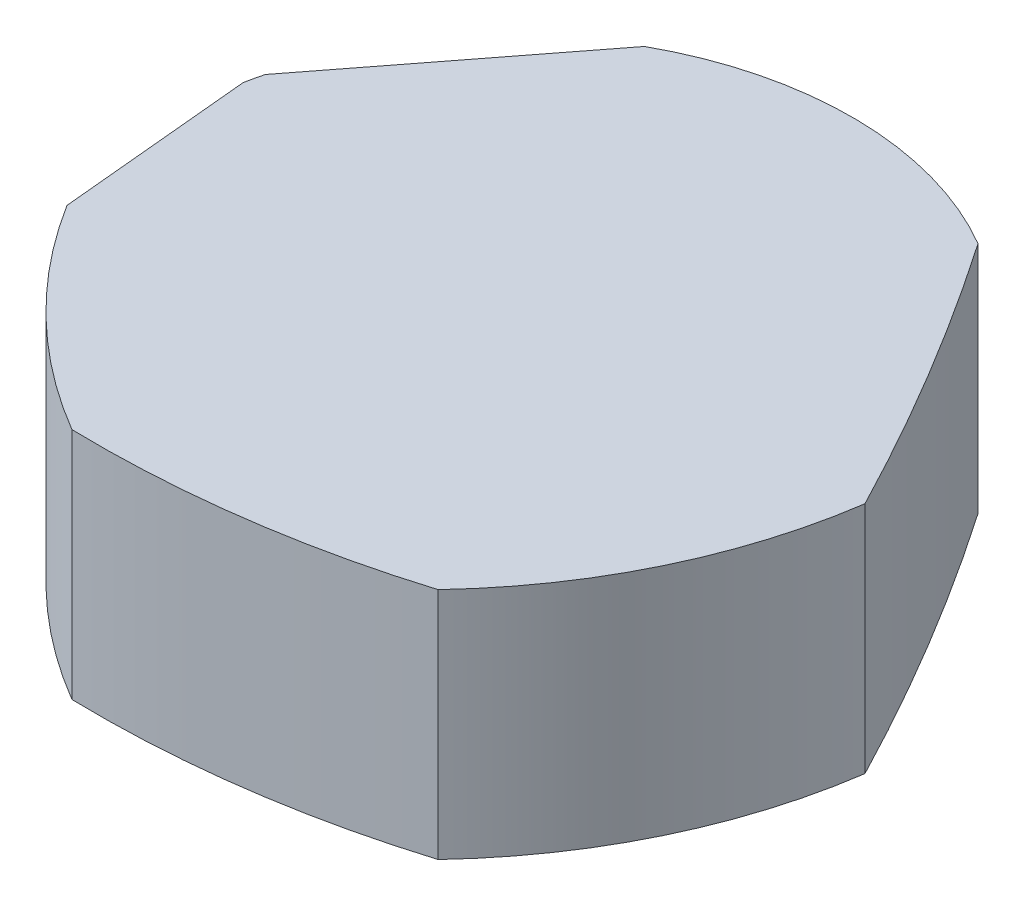
ISO-10303-21;
HEADER;
FILE_DESCRIPTION(('STEP AP214'),'2;1');
FILE_NAME('part.step','',(''),(''),'','','');
FILE_SCHEMA(('AUTOMOTIVE_DESIGN { 1 0 10303 214 1 1 1 1 }'));
ENDSEC;
DATA;
#1=APPLICATION_CONTEXT('core data for automotive mechanical design processes');
#2=APPLICATION_PROTOCOL_DEFINITION('international standard','automotive_design',2000,#1);
#3=PRODUCT_CONTEXT('',#1,'mechanical');
#4=PRODUCT('Part','Part','',(#3));
#5=PRODUCT_RELATED_PRODUCT_CATEGORY('part','',(#4));
#6=PRODUCT_DEFINITION_FORMATION('','',#4);
#7=PRODUCT_DEFINITION_CONTEXT('part definition',#1,'design');
#8=PRODUCT_DEFINITION('design','',#6,#7);
#9=PRODUCT_DEFINITION_SHAPE('','',#8);
#10=(LENGTH_UNIT() NAMED_UNIT(*) SI_UNIT(.MILLI.,.METRE.));
#11=(NAMED_UNIT(*) PLANE_ANGLE_UNIT() SI_UNIT($,.RADIAN.));
#12=(NAMED_UNIT(*) SI_UNIT($,.STERADIAN.) SOLID_ANGLE_UNIT());
#13=UNCERTAINTY_MEASURE_WITH_UNIT(LENGTH_MEASURE(1.E-05),#10,'distance_accuracy_value','');
#14=(GEOMETRIC_REPRESENTATION_CONTEXT(3) GLOBAL_UNCERTAINTY_ASSIGNED_CONTEXT((#13)) GLOBAL_UNIT_ASSIGNED_CONTEXT((#10,
#11,#12)) REPRESENTATION_CONTEXT('',''));
#15=CARTESIAN_POINT('',(0.,0.,0.));
#16=DIRECTION('',(0.,0.,1.));
#17=DIRECTION('',(1.,0.,0.));
#18=AXIS2_PLACEMENT_3D('',#15,#16,#17);
#19=CARTESIAN_POINT('',(73.6872230639614,100.,-75.5879370558731));
#20=DIRECTION('',(0.,-1.,0.));
#21=DIRECTION('',(0.,0.,-1.));
#22=AXIS2_PLACEMENT_3D('',#19,#20,#21);
#23=CYLINDRICAL_SURFACE('',#22,246.295937741167);
#24=CARTESIAN_POINT('',(73.6872230639614,0.,-75.5879370558731));
#25=DIRECTION('',(0.,1.,0.));
#26=DIRECTION('',(0.,0.,1.));
#27=AXIS2_PLACEMENT_3D('',#24,#25,#26);
#28=CIRCLE('',#27,246.295937741167);
#29=CARTESIAN_POINT('',(-135.351509673323,0.,54.659892727932));
#30=VERTEX_POINT('',#29);
#31=CARTESIAN_POINT('',(-51.195880989318,0.,136.699366544268));
#32=VERTEX_POINT('',#31);
#33=EDGE_CURVE('E140',#30,#32,#28,.T.);
#34=ORIENTED_EDGE('',*,*,#33,.T.);
#35=DIRECTION('',(0.,-1.,0.));
#36=VECTOR('',#35,1.);
#37=CARTESIAN_POINT('',(-51.195880989318,100.,136.699366544268));
#38=LINE('',#37,#36);
#39=CARTESIAN_POINT('',(-51.195880989318,100.,136.699366544268));
#40=VERTEX_POINT('',#39);
#41=EDGE_CURVE('E11',#40,#32,#38,.T.);
#42=ORIENTED_EDGE('',*,*,#41,.F.);
#43=CARTESIAN_POINT('',(73.6872230639614,100.,-75.5879370558731));
#44=DIRECTION('',(0.,1.,0.));
#45=DIRECTION('',(0.,0.,1.));
#46=AXIS2_PLACEMENT_3D('',#43,#44,#45);
#47=CIRCLE('',#46,246.295937741167);
#48=CARTESIAN_POINT('',(-135.351509673323,100.,54.659892727932));
#49=VERTEX_POINT('',#48);
#50=EDGE_CURVE('E162',#49,#40,#47,.T.);
#51=ORIENTED_EDGE('',*,*,#50,.F.);
#52=DIRECTION('',(0.,-1.,0.));
#53=VECTOR('',#52,1.);
#54=CARTESIAN_POINT('',(-135.351509673323,100.,54.659892727932));
#55=LINE('',#54,#53);
#56=EDGE_CURVE('E136',#49,#30,#55,.T.);
#57=ORIENTED_EDGE('',*,*,#56,.T.);
#58=EDGE_LOOP('',(#34,#42,#51,#57));
#59=FACE_BOUND('',#58,.T.);
#60=ADVANCED_FACE('F39',(#59),#23,.T.);
#61=CARTESIAN_POINT('',(-41.1861018587533,100.,-297.581542449005));
#62=DIRECTION('',(0.,-1.,0.));
#63=DIRECTION('',(0.,0.,-1.));
#64=AXIS2_PLACEMENT_3D('',#61,#62,#63);
#65=CYLINDRICAL_SURFACE('',#64,434.396251818851);
#66=CARTESIAN_POINT('',(-41.1861018587533,0.,-297.581542449005));
#67=DIRECTION('',(0.,1.,0.));
#68=DIRECTION('',(0.,0.,1.));
#69=AXIS2_PLACEMENT_3D('',#66,#67,#68);
#70=CIRCLE('',#69,434.396251818851);
#71=CARTESIAN_POINT('',(86.3993353750459,0.,117.655811121368));
#72=VERTEX_POINT('',#71);
#73=EDGE_CURVE('E144',#32,#72,#70,.T.);
#74=ORIENTED_EDGE('',*,*,#73,.T.);
#75=DIRECTION('',(0.,-1.,0.));
#76=VECTOR('',#75,1.);
#77=CARTESIAN_POINT('',(86.3993353750459,100.,117.655811121368));
#78=LINE('',#77,#76);
#79=CARTESIAN_POINT('',(86.3993353750459,100.,117.655811121368));
#80=VERTEX_POINT('',#79);
#81=EDGE_CURVE('E48',#80,#72,#78,.T.);
#82=ORIENTED_EDGE('',*,*,#81,.F.);
#83=CARTESIAN_POINT('',(-41.1861018587533,100.,-297.581542449005));
#84=DIRECTION('',(0.,1.,0.));
#85=DIRECTION('',(0.,0.,1.));
#86=AXIS2_PLACEMENT_3D('',#83,#84,#85);
#87=CIRCLE('',#86,434.396251818851);
#88=EDGE_CURVE('E99',#40,#80,#87,.T.);
#89=ORIENTED_EDGE('',*,*,#88,.F.);
#90=ORIENTED_EDGE('',*,*,#41,.T.);
#91=EDGE_LOOP('',(#74,#82,#89,#90));
#92=FACE_BOUND('',#91,.T.);
#93=ADVANCED_FACE('F208',(#92),#65,.T.);
#94=CARTESIAN_POINT('',(-78.5306853637809,100.,-37.9310166919516));
#95=DIRECTION('',(0.,-1.,0.));
#96=DIRECTION('',(0.,0.,-1.));
#97=AXIS2_PLACEMENT_3D('',#94,#95,#96);
#98=CYLINDRICAL_SURFACE('',#97,226.735909661265);
#99=CARTESIAN_POINT('',(-78.5306853637809,0.,-37.9310166919516));
#100=DIRECTION('',(0.,1.,0.));
#101=DIRECTION('',(0.,0.,1.));
#102=AXIS2_PLACEMENT_3D('',#99,#100,#101);
#103=CIRCLE('',#102,226.735909661265);
#104=CARTESIAN_POINT('',(145.869241729159,0.,-5.46803083721936));
#105=VERTEX_POINT('',#104);
#106=EDGE_CURVE('E147',#72,#105,#103,.T.);
#107=ORIENTED_EDGE('',*,*,#106,.T.);
#108=DIRECTION('',(0.,-1.,0.));
#109=VECTOR('',#108,1.);
#110=CARTESIAN_POINT('',(145.869241729159,100.,-5.46803083721936));
#111=LINE('',#110,#109);
#112=CARTESIAN_POINT('',(145.869241729159,100.,-5.46803083721936));
#113=VERTEX_POINT('',#112);
#114=EDGE_CURVE('E173',#113,#105,#111,.T.);
#115=ORIENTED_EDGE('',*,*,#114,.F.);
#116=CARTESIAN_POINT('',(-78.5306853637809,100.,-37.9310166919516));
#117=DIRECTION('',(0.,1.,0.));
#118=DIRECTION('',(0.,0.,1.));
#119=AXIS2_PLACEMENT_3D('',#116,#117,#118);
#120=CIRCLE('',#119,226.735909661265);
#121=EDGE_CURVE('E183',#80,#113,#120,.T.);
#122=ORIENTED_EDGE('',*,*,#121,.F.);
#123=ORIENTED_EDGE('',*,*,#81,.T.);
#124=EDGE_LOOP('',(#107,#115,#122,#123));
#125=FACE_BOUND('',#124,.T.);
#126=ADVANCED_FACE('F181',(#125),#98,.T.);
#127=CARTESIAN_POINT('',(-855.59788044615,100.,512.352551874293));
#128=DIRECTION('',(0.,-1.,0.));
#129=DIRECTION('',(0.,0.,-1.));
#130=AXIS2_PLACEMENT_3D('',#127,#128,#129);
#131=CYLINDRICAL_SURFACE('',#130,1127.4194218115);
#132=CARTESIAN_POINT('',(-855.59788044615,0.,512.352551874293));
#133=DIRECTION('',(0.,1.,0.));
#134=DIRECTION('',(0.,0.,1.));
#135=AXIS2_PLACEMENT_3D('',#132,#133,#134);
#136=CIRCLE('',#135,1127.4194218115);
#137=CARTESIAN_POINT('',(73.6872230639614,0.,-126.00765135895));
#138=VERTEX_POINT('',#137);
#139=EDGE_CURVE('E150',#105,#138,#136,.T.);
#140=ORIENTED_EDGE('',*,*,#139,.T.);
#141=DIRECTION('',(0.,-1.,0.));
#142=VECTOR('',#141,1.);
#143=CARTESIAN_POINT('',(73.6872230639614,100.,-126.00765135895));
#144=LINE('',#143,#142);
#145=CARTESIAN_POINT('',(73.6872230639614,100.,-126.00765135895));
#146=VERTEX_POINT('',#145);
#147=EDGE_CURVE('E169',#146,#138,#144,.T.);
#148=ORIENTED_EDGE('',*,*,#147,.F.);
#149=CARTESIAN_POINT('',(-855.59788044615,100.,512.352551874293));
#150=DIRECTION('',(0.,1.,0.));
#151=DIRECTION('',(0.,0.,1.));
#152=AXIS2_PLACEMENT_3D('',#149,#150,#151);
#153=CIRCLE('',#152,1127.4194218115);
#154=EDGE_CURVE('E196',#113,#146,#153,.T.);
#155=ORIENTED_EDGE('',*,*,#154,.F.);
#156=ORIENTED_EDGE('',*,*,#114,.T.);
#157=EDGE_LOOP('',(#140,#148,#155,#156));
#158=FACE_BOUND('',#157,.T.);
#159=ADVANCED_FACE('F191',(#158),#131,.T.);
#160=CARTESIAN_POINT('',(0.,100.,0.));
#161=DIRECTION('',(0.,-1.,0.));
#162=DIRECTION('',(0.,0.,-1.));
#163=AXIS2_PLACEMENT_3D('',#160,#161,#162);
#164=CYLINDRICAL_SURFACE('',#163,145.971692611535);
#165=CARTESIAN_POINT('',(0.,0.,0.));
#166=DIRECTION('',(0.,1.,0.));
#167=DIRECTION('',(0.,0.,1.));
#168=AXIS2_PLACEMENT_3D('',#165,#166,#167);
#169=CIRCLE('',#168,145.971692611535);
#170=CARTESIAN_POINT('',(-70.7297247979094,0.,-127.691194190863));
#171=VERTEX_POINT('',#170);
#172=EDGE_CURVE('E153',#138,#171,#169,.T.);
#173=ORIENTED_EDGE('',*,*,#172,.T.);
#174=DIRECTION('',(0.,-1.,0.));
#175=VECTOR('',#174,1.);
#176=CARTESIAN_POINT('',(-70.7297247979094,100.,-127.691194190863));
#177=LINE('',#176,#175);
#178=CARTESIAN_POINT('',(-70.7297247979094,100.,-127.691194190863));
#179=VERTEX_POINT('',#178);
#180=EDGE_CURVE('E129',#179,#171,#177,.T.);
#181=ORIENTED_EDGE('',*,*,#180,.F.);
#182=CARTESIAN_POINT('',(0.,100.,0.));
#183=DIRECTION('',(0.,1.,0.));
#184=DIRECTION('',(0.,0.,1.));
#185=AXIS2_PLACEMENT_3D('',#182,#183,#184);
#186=CIRCLE('',#185,145.971692611535);
#187=EDGE_CURVE('E118',#146,#179,#186,.T.);
#188=ORIENTED_EDGE('',*,*,#187,.F.);
#189=ORIENTED_EDGE('',*,*,#147,.T.);
#190=EDGE_LOOP('',(#173,#181,#188,#189));
#191=FACE_BOUND('',#190,.T.);
#192=ADVANCED_FACE('F194',(#191),#164,.T.);
#193=CARTESIAN_POINT('',(-141.399603300586,100.,-36.2475824064657));
#194=DIRECTION('',(0.791247715946565,0.,0.611495749788454));
#195=DIRECTION('',(0.611495749788454,0.,-0.791247715946565));
#196=AXIS2_PLACEMENT_3D('',#193,#194,#195);
#197=PLANE('',#196);
#198=DIRECTION('',(-0.611495749788454,0.,0.791247715946565));
#199=VECTOR('',#198,1.);
#200=CARTESIAN_POINT('',(-141.399603300586,0.,-36.2475824064657));
#201=LINE('',#200,#199);
#202=CARTESIAN_POINT('',(-141.399603300586,0.,-36.2475824064658));
#203=VERTEX_POINT('',#202);
#204=EDGE_CURVE('E127',#171,#203,#201,.T.);
#205=ORIENTED_EDGE('',*,*,#204,.T.);
#206=DIRECTION('',(0.,-1.,0.));
#207=VECTOR('',#206,1.);
#208=CARTESIAN_POINT('',(-141.399603300586,100.,-36.2475824064658));
#209=LINE('',#208,#207);
#210=CARTESIAN_POINT('',(-141.399603300586,100.,-36.2475824064658));
#211=VERTEX_POINT('',#210);
#212=EDGE_CURVE('E124',#211,#203,#209,.T.);
#213=ORIENTED_EDGE('',*,*,#212,.F.);
#214=DIRECTION('',(-0.611495749788454,0.,0.791247715946565));
#215=VECTOR('',#214,1.);
#216=CARTESIAN_POINT('',(-141.399603300586,100.,-36.2475824064657));
#217=LINE('',#216,#215);
#218=EDGE_CURVE('E112',#179,#211,#217,.T.);
#219=ORIENTED_EDGE('',*,*,#218,.F.);
#220=ORIENTED_EDGE('',*,*,#180,.T.);
#221=EDGE_LOOP('',(#205,#213,#219,#220));
#222=FACE_BOUND('',#221,.T.);
#223=ADVANCED_FACE('F125',(#222),#197,.F.);
#224=CARTESIAN_POINT('',(0.,100.,0.));
#225=DIRECTION('',(0.,-1.,0.));
#226=DIRECTION('',(0.,0.,-1.));
#227=AXIS2_PLACEMENT_3D('',#224,#225,#226);
#228=CYLINDRICAL_SURFACE('',#227,145.971692611535);
#229=CARTESIAN_POINT('',(0.,0.,0.));
#230=DIRECTION('',(0.,1.,0.));
#231=DIRECTION('',(0.,0.,1.));
#232=AXIS2_PLACEMENT_3D('',#229,#230,#231);
#233=CIRCLE('',#232,145.971692611535);
#234=CARTESIAN_POINT('',(-143.161862869987,0.,-28.5029132453465));
#235=VERTEX_POINT('',#234);
#236=EDGE_CURVE('E85',#203,#235,#233,.T.);
#237=ORIENTED_EDGE('',*,*,#236,.T.);
#238=DIRECTION('',(0.,-1.,0.));
#239=VECTOR('',#238,1.);
#240=CARTESIAN_POINT('',(-143.161862869987,100.,-28.5029132453465));
#241=LINE('',#240,#239);
#242=CARTESIAN_POINT('',(-143.161862869987,100.,-28.5029132453465));
#243=VERTEX_POINT('',#242);
#244=EDGE_CURVE('E130',#243,#235,#241,.T.);
#245=ORIENTED_EDGE('',*,*,#244,.F.);
#246=CARTESIAN_POINT('',(0.,100.,0.));
#247=DIRECTION('',(0.,1.,0.));
#248=DIRECTION('',(0.,0.,1.));
#249=AXIS2_PLACEMENT_3D('',#246,#247,#248);
#250=CIRCLE('',#249,145.971692611535);
#251=EDGE_CURVE('E116',#211,#243,#250,.T.);
#252=ORIENTED_EDGE('',*,*,#251,.F.);
#253=ORIENTED_EDGE('',*,*,#212,.T.);
#254=EDGE_LOOP('',(#237,#245,#252,#253));
#255=FACE_BOUND('',#254,.T.);
#256=ADVANCED_FACE('F132',(#255),#228,.T.);
#257=CARTESIAN_POINT('',(-135.351509673323,100.,54.659892727932));
#258=DIRECTION('',(0.995618814123472,0.,-0.0935049568919857));
#259=DIRECTION('',(-0.0935049568919857,0.,-0.995618814123472));
#260=AXIS2_PLACEMENT_3D('',#257,#258,#259);
#261=PLANE('',#260);
#262=DIRECTION('',(0.0935049568919857,0.,0.995618814123472));
#263=VECTOR('',#262,1.);
#264=CARTESIAN_POINT('',(-135.351509673323,0.,54.659892727932));
#265=LINE('',#264,#263);
#266=EDGE_CURVE('E91',#235,#30,#265,.T.);
#267=ORIENTED_EDGE('',*,*,#266,.T.);
#268=ORIENTED_EDGE('',*,*,#56,.F.);
#269=DIRECTION('',(0.0935049568919857,0.,0.995618814123472));
#270=VECTOR('',#269,1.);
#271=CARTESIAN_POINT('',(-135.351509673323,100.,54.659892727932));
#272=LINE('',#271,#270);
#273=EDGE_CURVE('E56',#243,#49,#272,.T.);
#274=ORIENTED_EDGE('',*,*,#273,.F.);
#275=ORIENTED_EDGE('',*,*,#244,.T.);
#276=EDGE_LOOP('',(#267,#268,#274,#275));
#277=FACE_BOUND('',#276,.T.);
#278=ADVANCED_FACE('F224',(#277),#261,.F.);
#279=CARTESIAN_POINT('',(73.6872230639614,100.,-75.5879370558731));
#280=DIRECTION('',(0.,1.,0.));
#281=DIRECTION('',(0.,0.,1.));
#282=AXIS2_PLACEMENT_3D('',#279,#280,#281);
#283=PLANE('',#282);
#284=ORIENTED_EDGE('',*,*,#50,.T.);
#285=ORIENTED_EDGE('',*,*,#88,.T.);
#286=ORIENTED_EDGE('',*,*,#121,.T.);
#287=ORIENTED_EDGE('',*,*,#154,.T.);
#288=ORIENTED_EDGE('',*,*,#187,.T.);
#289=ORIENTED_EDGE('',*,*,#218,.T.);
#290=ORIENTED_EDGE('',*,*,#251,.T.);
#291=ORIENTED_EDGE('',*,*,#273,.T.);
#292=EDGE_LOOP('',(#284,#285,#286,#287,#288,#289,#290,#291));
#293=FACE_BOUND('',#292,.T.);
#294=ADVANCED_FACE('F114',(#293),#283,.T.);
#295=CARTESIAN_POINT('',(73.6872230639614,0.,-75.5879370558731));
#296=DIRECTION('',(0.,1.,0.));
#297=DIRECTION('',(0.,0.,1.));
#298=AXIS2_PLACEMENT_3D('',#295,#296,#297);
#299=PLANE('',#298);
#300=ORIENTED_EDGE('',*,*,#33,.F.);
#301=ORIENTED_EDGE('',*,*,#266,.F.);
#302=ORIENTED_EDGE('',*,*,#236,.F.);
#303=ORIENTED_EDGE('',*,*,#204,.F.);
#304=ORIENTED_EDGE('',*,*,#172,.F.);
#305=ORIENTED_EDGE('',*,*,#139,.F.);
#306=ORIENTED_EDGE('',*,*,#106,.F.);
#307=ORIENTED_EDGE('',*,*,#73,.F.);
#308=EDGE_LOOP('',(#300,#301,#302,#303,#304,#305,#306,#307));
#309=FACE_BOUND('',#308,.T.);
#310=ADVANCED_FACE('F187',(#309),#299,.F.);
#311=CLOSED_SHELL('',(#60,#93,#126,#159,#192,#223,#256,#278,#294,#310));
#312=MANIFOLD_SOLID_BREP('B2',#311);
#313=ADVANCED_BREP_SHAPE_REPRESENTATION('',(#18,#312),#14);
#314=SHAPE_DEFINITION_REPRESENTATION(#9,#313);
ENDSEC;
END-ISO-10303-21;
